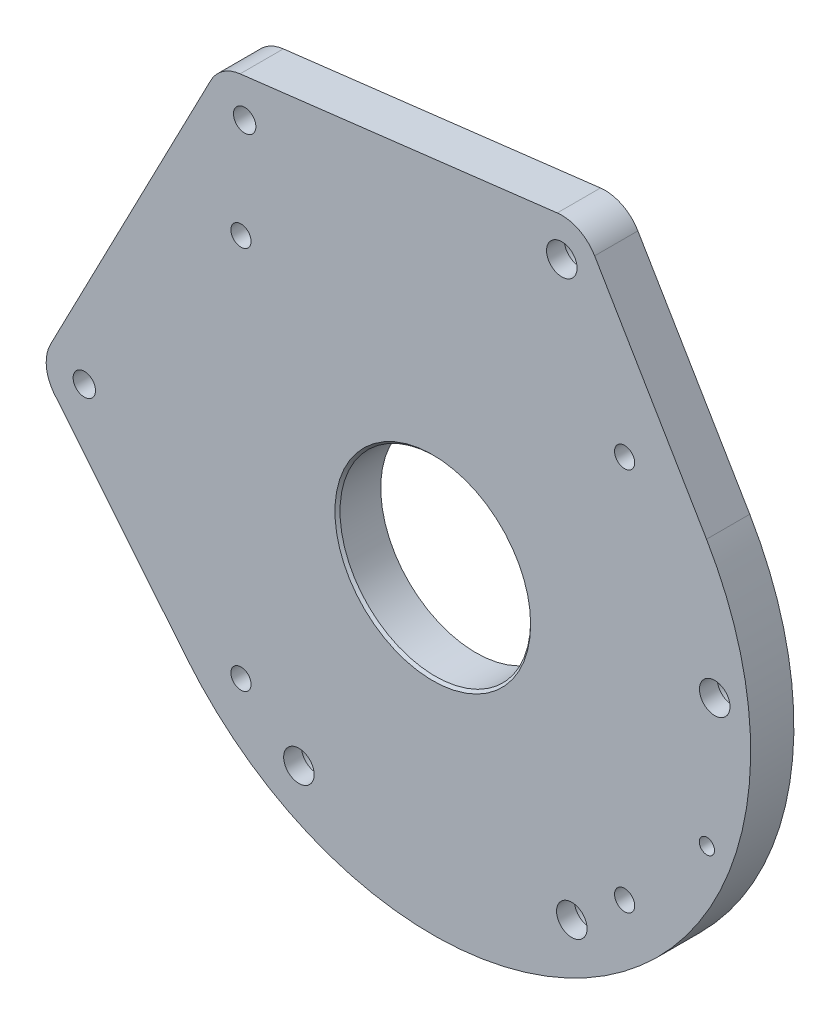
ISO-10303-21;
HEADER;
FILE_DESCRIPTION(('STEP AP214'),'2;1');
FILE_NAME('part.step','',(''),(''),'','','');
FILE_SCHEMA(('AUTOMOTIVE_DESIGN { 1 0 10303 214 1 1 1 1 }'));
ENDSEC;
DATA;
#1=APPLICATION_CONTEXT('core data for automotive mechanical design processes');
#2=APPLICATION_PROTOCOL_DEFINITION('international standard','automotive_design',2000,#1);
#3=PRODUCT_CONTEXT('',#1,'mechanical');
#4=PRODUCT('Part','Part','',(#3));
#5=PRODUCT_RELATED_PRODUCT_CATEGORY('part','',(#4));
#6=PRODUCT_DEFINITION_FORMATION('','',#4);
#7=PRODUCT_DEFINITION_CONTEXT('part definition',#1,'design');
#8=PRODUCT_DEFINITION('design','',#6,#7);
#9=PRODUCT_DEFINITION_SHAPE('','',#8);
#10=(LENGTH_UNIT() NAMED_UNIT(*) SI_UNIT(.MILLI.,.METRE.));
#11=(NAMED_UNIT(*) PLANE_ANGLE_UNIT() SI_UNIT($,.RADIAN.));
#12=(NAMED_UNIT(*) SI_UNIT($,.STERADIAN.) SOLID_ANGLE_UNIT());
#13=UNCERTAINTY_MEASURE_WITH_UNIT(LENGTH_MEASURE(1.E-05),#10,'distance_accuracy_value','');
#14=(GEOMETRIC_REPRESENTATION_CONTEXT(3) GLOBAL_UNCERTAINTY_ASSIGNED_CONTEXT((#13)) GLOBAL_UNIT_ASSIGNED_CONTEXT((#10,
#11,#12)) REPRESENTATION_CONTEXT('',''));
#15=CARTESIAN_POINT('',(0.,0.,0.));
#16=DIRECTION('',(0.,0.,1.));
#17=DIRECTION('',(1.,0.,0.));
#18=AXIS2_PLACEMENT_3D('',#15,#16,#17);
#19=CARTESIAN_POINT('',(0.,0.,0.));
#20=DIRECTION('',(0.,0.,1.));
#21=DIRECTION('',(1.,0.,0.));
#22=AXIS2_PLACEMENT_3D('',#19,#20,#21);
#23=PLANE('',#22);
#24=CARTESIAN_POINT('',(50.73,130.43,0.));
#25=DIRECTION('',(0.,0.,-1.));
#26=DIRECTION('',(-1.,0.,0.));
#27=AXIS2_PLACEMENT_3D('',#24,#25,#26);
#28=CIRCLE('',#27,9.025);
#29=CARTESIAN_POINT('',(41.705,130.43,0.));
#30=VERTEX_POINT('',#29);
#31=EDGE_CURVE('E638',#30,#30,#28,.T.);
#32=ORIENTED_EDGE('',*,*,#31,.F.);
#33=EDGE_LOOP('',(#32));
#34=FACE_BOUND('',#33,.T.);
#35=CARTESIAN_POINT('',(110.87,11.1,0.));
#36=DIRECTION('',(0.,0.,-1.));
#37=DIRECTION('',(-1.,0.,0.));
#38=AXIS2_PLACEMENT_3D('',#35,#36,#37);
#39=CIRCLE('',#38,9.02500000000001);
#40=CARTESIAN_POINT('',(101.845,11.1,0.));
#41=VERTEX_POINT('',#40);
#42=EDGE_CURVE('E172',#41,#41,#39,.T.);
#43=ORIENTED_EDGE('',*,*,#42,.F.);
#44=EDGE_LOOP('',(#43));
#45=FACE_BOUND('',#44,.T.);
#46=CARTESIAN_POINT('',(54.67,-92.57,0.));
#47=DIRECTION('',(0.,0.,-1.));
#48=DIRECTION('',(-1.,0.,0.));
#49=AXIS2_PLACEMENT_3D('',#46,#47,#48);
#50=CIRCLE('',#49,9.025);
#51=CARTESIAN_POINT('',(45.645,-92.57,0.));
#52=VERTEX_POINT('',#51);
#53=EDGE_CURVE('E159',#52,#52,#50,.T.);
#54=ORIENTED_EDGE('',*,*,#53,.F.);
#55=EDGE_LOOP('',(#54));
#56=FACE_BOUND('',#55,.T.);
#57=CARTESIAN_POINT('',(-137.03,-5.98999999999999,0.));
#58=DIRECTION('',(0.,0.,-1.));
#59=DIRECTION('',(-1.,0.,0.));
#60=AXIS2_PLACEMENT_3D('',#57,#58,#59);
#61=CIRCLE('',#60,4.39999999999999);
#62=CARTESIAN_POINT('',(-141.43,-5.98999999999999,0.));
#63=VERTEX_POINT('',#62);
#64=EDGE_CURVE('E222',#63,#63,#61,.T.);
#65=ORIENTED_EDGE('',*,*,#64,.F.);
#66=EDGE_LOOP('',(#65));
#67=FACE_BOUND('',#66,.T.);
#68=CARTESIAN_POINT('',(0.,0.,0.));
#69=DIRECTION('',(0.,0.,1.));
#70=DIRECTION('',(1.,0.,0.));
#71=AXIS2_PLACEMENT_3D('',#68,#69,#70);
#72=CIRCLE('',#71,37.475);
#73=CARTESIAN_POINT('',(37.475,0.,0.));
#74=VERTEX_POINT('',#73);
#75=EDGE_CURVE('E228',#74,#74,#72,.T.);
#76=ORIENTED_EDGE('',*,*,#75,.T.);
#77=EDGE_LOOP('',(#76));
#78=FACE_BOUND('',#77,.T.);
#79=DIRECTION('',(0.508446953838153,-0.86109331383579,0.));
#80=VECTOR('',#79,1.);
#81=CARTESIAN_POINT('',(107.636664229474,63.5558692297692,0.));
#82=LINE('',#81,#80);
#83=CARTESIAN_POINT('',(63.6463997075369,138.056704307572,0.));
#84=VERTEX_POINT('',#83);
#85=CARTESIAN_POINT('',(107.636664229474,63.5558692297692,0.));
#86=VERTEX_POINT('',#85);
#87=EDGE_CURVE('E254',#84,#86,#82,.T.);
#88=ORIENTED_EDGE('',*,*,#87,.T.);
#89=CARTESIAN_POINT('',(0.,0.,0.));
#90=DIRECTION('',(0.,0.,1.));
#91=DIRECTION('',(1.,0.,0.));
#92=AXIS2_PLACEMENT_3D('',#89,#90,#91);
#93=CIRCLE('',#92,125.);
#94=CARTESIAN_POINT('',(-96.9397614082453,-78.9156680141053,0.));
#95=VERTEX_POINT('',#94);
#96=EDGE_CURVE('E84',#95,#86,#93,.T.);
#97=ORIENTED_EDGE('',*,*,#96,.F.);
#98=DIRECTION('',(0.631325344112842,-0.775518091265962,0.));
#99=VECTOR('',#98,1.);
#100=CARTESIAN_POINT('',(-96.9397614082453,-78.9156680141053,0.));
#101=LINE('',#100,#99);
#102=CARTESIAN_POINT('',(-147.843963587509,-16.3851042095525,0.));
#103=VERTEX_POINT('',#102);
#104=EDGE_CURVE('E269',#103,#95,#101,.T.);
#105=ORIENTED_EDGE('',*,*,#104,.F.);
#106=CARTESIAN_POINT('',(-137.03,-5.98999999999999,0.));
#107=DIRECTION('',(0.,0.,1.));
#108=DIRECTION('',(1.,0.,0.));
#109=AXIS2_PLACEMENT_3D('',#106,#107,#108);
#110=CIRCLE('',#109,14.999999999981);
#111=CARTESIAN_POINT('',(-150.342449774275,0.922212453825781,0.));
#112=VERTEX_POINT('',#111);
#113=EDGE_CURVE('E132',#112,#103,#110,.T.);
#114=ORIENTED_EDGE('',*,*,#113,.F.);
#115=DIRECTION('',(0.460814163588969,0.887496651619486,0.));
#116=VECTOR('',#115,1.);
#117=CARTESIAN_POINT('',(-118.794434839627,61.6815376483444,0.));
#118=LINE('',#117,#116);
#119=CARTESIAN_POINT('',(-87.2924497742754,122.352212453826,0.));
#120=VERTEX_POINT('',#119);
#121=EDGE_CURVE('E265',#112,#120,#118,.T.);
#122=ORIENTED_EDGE('',*,*,#121,.T.);
#123=CARTESIAN_POINT('',(-73.98,115.44,0.));
#124=DIRECTION('',(0.,0.,1.));
#125=DIRECTION('',(1.,0.,0.));
#126=AXIS2_PLACEMENT_3D('',#123,#124,#125);
#127=CIRCLE('',#126,14.999999999981);
#128=CARTESIAN_POINT('',(-75.7700978360802,130.332801943781,0.));
#129=VERTEX_POINT('',#128);
#130=EDGE_CURVE('E262',#129,#120,#127,.T.);
#131=ORIENTED_EDGE('',*,*,#130,.F.);
#132=DIRECTION('',(0.992853462919999,0.119339855738833,0.));
#133=VECTOR('',#132,1.);
#134=CARTESIAN_POINT('',(-16.5218590966342,137.454372777759,0.));
#135=LINE('',#134,#133);
#136=CARTESIAN_POINT('',(48.9399021639175,145.3228019438,0.));
#137=VERTEX_POINT('',#136);
#138=EDGE_CURVE('E259',#129,#137,#135,.T.);
#139=ORIENTED_EDGE('',*,*,#138,.T.);
#140=CARTESIAN_POINT('',(50.73,130.43,0.));
#141=DIRECTION('',(0.,0.,1.));
#142=DIRECTION('',(1.,0.,0.));
#143=AXIS2_PLACEMENT_3D('',#140,#141,#142);
#144=CIRCLE('',#143,15.);
#145=EDGE_CURVE('E256',#84,#137,#144,.T.);
#146=ORIENTED_EDGE('',*,*,#145,.F.);
#147=EDGE_LOOP('',(#88,#97,#105,#114,#122,#131,#139,#146));
#148=FACE_BOUND('',#147,.T.);
#149=CARTESIAN_POINT('',(-73.98,115.44,0.));
#150=DIRECTION('',(0.,0.,1.));
#151=DIRECTION('',(1.,0.,0.));
#152=AXIS2_PLACEMENT_3D('',#149,#150,#151);
#153=CIRCLE('',#152,4.4);
#154=CARTESIAN_POINT('',(-69.58,115.44,0.));
#155=VERTEX_POINT('',#154);
#156=EDGE_CURVE('E219',#155,#155,#153,.T.);
#157=ORIENTED_EDGE('',*,*,#156,.T.);
#158=EDGE_LOOP('',(#157));
#159=FACE_BOUND('',#158,.T.);
#160=CARTESIAN_POINT('',(107.78,-40.88,0.));
#161=DIRECTION('',(0.,0.,1.));
#162=DIRECTION('',(1.,0.,0.));
#163=AXIS2_PLACEMENT_3D('',#160,#161,#162);
#164=CIRCLE('',#163,3.);
#165=CARTESIAN_POINT('',(110.78,-40.88,0.));
#166=VERTEX_POINT('',#165);
#167=EDGE_CURVE('E213',#166,#166,#164,.T.);
#168=ORIENTED_EDGE('',*,*,#167,.T.);
#169=EDGE_LOOP('',(#168));
#170=FACE_BOUND('',#169,.T.);
#171=CARTESIAN_POINT('',(75.4341514169814,75.4341514169847,0.));
#172=DIRECTION('',(0.,0.,1.));
#173=DIRECTION('',(1.,0.,0.));
#174=AXIS2_PLACEMENT_3D('',#171,#172,#173);
#175=CIRCLE('',#174,3.96874999999999);
#176=CARTESIAN_POINT('',(79.4029014169814,75.4341514169847,0.));
#177=VERTEX_POINT('',#176);
#178=EDGE_CURVE('E207',#177,#177,#175,.T.);
#179=ORIENTED_EDGE('',*,*,#178,.T.);
#180=EDGE_LOOP('',(#179));
#181=FACE_BOUND('',#180,.T.);
#182=CARTESIAN_POINT('',(75.4341514169848,-75.4341514169771,0.));
#183=DIRECTION('',(0.,0.,1.));
#184=DIRECTION('',(1.,0.,0.));
#185=AXIS2_PLACEMENT_3D('',#182,#183,#184);
#186=CIRCLE('',#185,3.96874999999999);
#187=CARTESIAN_POINT('',(79.4029014169848,-75.4341514169771,0.));
#188=VERTEX_POINT('',#187);
#189=EDGE_CURVE('E201',#188,#188,#186,.T.);
#190=ORIENTED_EDGE('',*,*,#189,.T.);
#191=EDGE_LOOP('',(#190));
#192=FACE_BOUND('',#191,.T.);
#193=CARTESIAN_POINT('',(-75.4341514169771,-75.4341514169806,0.));
#194=DIRECTION('',(0.,0.,1.));
#195=DIRECTION('',(1.,0.,0.));
#196=AXIS2_PLACEMENT_3D('',#193,#194,#195);
#197=CIRCLE('',#196,3.96874999999999);
#198=CARTESIAN_POINT('',(-71.4654014169771,-75.4341514169806,0.));
#199=VERTEX_POINT('',#198);
#200=EDGE_CURVE('E195',#199,#199,#197,.T.);
#201=ORIENTED_EDGE('',*,*,#200,.T.);
#202=EDGE_LOOP('',(#201));
#203=FACE_BOUND('',#202,.T.);
#204=CARTESIAN_POINT('',(-75.4341514169805,75.4341514169813,0.));
#205=DIRECTION('',(0.,0.,1.));
#206=DIRECTION('',(1.,0.,0.));
#207=AXIS2_PLACEMENT_3D('',#204,#205,#206);
#208=CIRCLE('',#207,3.96874999999999);
#209=CARTESIAN_POINT('',(-71.4654014169805,75.4341514169813,0.));
#210=VERTEX_POINT('',#209);
#211=EDGE_CURVE('E189',#210,#210,#208,.T.);
#212=ORIENTED_EDGE('',*,*,#211,.T.);
#213=EDGE_LOOP('',(#212));
#214=FACE_BOUND('',#213,.T.);
#215=CARTESIAN_POINT('',(-52.65,-93.77,0.));
#216=DIRECTION('',(0.,0.,-1.));
#217=DIRECTION('',(-1.,0.,0.));
#218=AXIS2_PLACEMENT_3D('',#215,#216,#217);
#219=CIRCLE('',#218,9.025);
#220=CARTESIAN_POINT('',(-61.675,-93.77,0.));
#221=VERTEX_POINT('',#220);
#222=EDGE_CURVE('E155',#221,#221,#219,.T.);
#223=ORIENTED_EDGE('',*,*,#222,.F.);
#224=EDGE_LOOP('',(#223));
#225=FACE_BOUND('',#224,.T.);
#226=ADVANCED_FACE('F37',(#34,#45,#56,#67,#78,#148,#159,#170,#181,#192,#203,#214,#225),#23,.F.);
#227=CARTESIAN_POINT('',(0.,0.,17.));
#228=DIRECTION('',(0.,0.,1.));
#229=DIRECTION('',(1.,0.,0.));
#230=AXIS2_PLACEMENT_3D('',#227,#228,#229);
#231=PLANE('',#230);
#232=CARTESIAN_POINT('',(0.,0.,17.));
#233=DIRECTION('',(0.,0.,1.));
#234=DIRECTION('',(1.,0.,0.));
#235=AXIS2_PLACEMENT_3D('',#232,#233,#234);
#236=CIRCLE('',#235,38.475);
#237=CARTESIAN_POINT('',(38.475,0.,17.));
#238=VERTEX_POINT('',#237);
#239=EDGE_CURVE('E11',#238,#238,#236,.F.);
#240=ORIENTED_EDGE('',*,*,#239,.T.);
#241=EDGE_LOOP('',(#240));
#242=FACE_BOUND('',#241,.T.);
#243=CARTESIAN_POINT('',(-75.4341514169805,75.4341514169813,17.));
#244=DIRECTION('',(0.,0.,1.));
#245=DIRECTION('',(1.,0.,0.));
#246=AXIS2_PLACEMENT_3D('',#243,#244,#245);
#247=CIRCLE('',#246,3.96874999999999);
#248=CARTESIAN_POINT('',(-71.4654014169805,75.4341514169813,17.));
#249=VERTEX_POINT('',#248);
#250=EDGE_CURVE('E151',#249,#249,#247,.T.);
#251=ORIENTED_EDGE('',*,*,#250,.F.);
#252=EDGE_LOOP('',(#251));
#253=FACE_BOUND('',#252,.T.);
#254=CARTESIAN_POINT('',(-75.4341514169771,-75.4341514169806,17.));
#255=DIRECTION('',(0.,0.,1.));
#256=DIRECTION('',(1.,0.,0.));
#257=AXIS2_PLACEMENT_3D('',#254,#255,#256);
#258=CIRCLE('',#257,3.96874999999999);
#259=CARTESIAN_POINT('',(-71.4654014169771,-75.4341514169806,17.));
#260=VERTEX_POINT('',#259);
#261=EDGE_CURVE('E192',#260,#260,#258,.T.);
#262=ORIENTED_EDGE('',*,*,#261,.F.);
#263=EDGE_LOOP('',(#262));
#264=FACE_BOUND('',#263,.T.);
#265=CARTESIAN_POINT('',(75.4341514169848,-75.4341514169771,17.));
#266=DIRECTION('',(0.,0.,1.));
#267=DIRECTION('',(1.,0.,0.));
#268=AXIS2_PLACEMENT_3D('',#265,#266,#267);
#269=CIRCLE('',#268,3.96874999999999);
#270=CARTESIAN_POINT('',(79.4029014169848,-75.4341514169771,17.));
#271=VERTEX_POINT('',#270);
#272=EDGE_CURVE('E198',#271,#271,#269,.T.);
#273=ORIENTED_EDGE('',*,*,#272,.F.);
#274=EDGE_LOOP('',(#273));
#275=FACE_BOUND('',#274,.T.);
#276=CARTESIAN_POINT('',(75.4341514169814,75.4341514169847,17.));
#277=DIRECTION('',(0.,0.,1.));
#278=DIRECTION('',(1.,0.,0.));
#279=AXIS2_PLACEMENT_3D('',#276,#277,#278);
#280=CIRCLE('',#279,3.96874999999999);
#281=CARTESIAN_POINT('',(79.4029014169814,75.4341514169847,17.));
#282=VERTEX_POINT('',#281);
#283=EDGE_CURVE('E204',#282,#282,#280,.T.);
#284=ORIENTED_EDGE('',*,*,#283,.F.);
#285=EDGE_LOOP('',(#284));
#286=FACE_BOUND('',#285,.T.);
#287=CARTESIAN_POINT('',(107.78,-40.88,17.));
#288=DIRECTION('',(0.,0.,1.));
#289=DIRECTION('',(1.,0.,0.));
#290=AXIS2_PLACEMENT_3D('',#287,#288,#289);
#291=CIRCLE('',#290,3.);
#292=CARTESIAN_POINT('',(110.78,-40.88,17.));
#293=VERTEX_POINT('',#292);
#294=EDGE_CURVE('E210',#293,#293,#291,.T.);
#295=ORIENTED_EDGE('',*,*,#294,.F.);
#296=EDGE_LOOP('',(#295));
#297=FACE_BOUND('',#296,.T.);
#298=CARTESIAN_POINT('',(-73.98,115.44,17.));
#299=DIRECTION('',(0.,0.,1.));
#300=DIRECTION('',(1.,0.,0.));
#301=AXIS2_PLACEMENT_3D('',#298,#299,#300);
#302=CIRCLE('',#301,4.4);
#303=CARTESIAN_POINT('',(-69.58,115.44,17.));
#304=VERTEX_POINT('',#303);
#305=EDGE_CURVE('E216',#304,#304,#302,.T.);
#306=ORIENTED_EDGE('',*,*,#305,.F.);
#307=EDGE_LOOP('',(#306));
#308=FACE_BOUND('',#307,.T.);
#309=DIRECTION('',(0.508446953838153,-0.86109331383579,0.));
#310=VECTOR('',#309,1.);
#311=CARTESIAN_POINT('',(107.636664229474,63.5558692297692,17.));
#312=LINE('',#311,#310);
#313=CARTESIAN_POINT('',(63.6463997075369,138.056704307572,17.));
#314=VERTEX_POINT('',#313);
#315=CARTESIAN_POINT('',(107.636664229474,63.5558692297692,17.));
#316=VERTEX_POINT('',#315);
#317=EDGE_CURVE('E241',#314,#316,#312,.T.);
#318=ORIENTED_EDGE('',*,*,#317,.F.);
#319=CARTESIAN_POINT('',(50.73,130.43,17.));
#320=DIRECTION('',(0.,0.,1.));
#321=DIRECTION('',(1.,0.,0.));
#322=AXIS2_PLACEMENT_3D('',#319,#320,#321);
#323=CIRCLE('',#322,15.);
#324=CARTESIAN_POINT('',(48.9399021639175,145.3228019438,17.));
#325=VERTEX_POINT('',#324);
#326=EDGE_CURVE('E243',#314,#325,#323,.T.);
#327=ORIENTED_EDGE('',*,*,#326,.T.);
#328=DIRECTION('',(0.992853462919999,0.119339855738833,0.));
#329=VECTOR('',#328,1.);
#330=CARTESIAN_POINT('',(-16.5218590966342,137.454372777759,17.));
#331=LINE('',#330,#329);
#332=CARTESIAN_POINT('',(-75.7700978360802,130.332801943781,17.));
#333=VERTEX_POINT('',#332);
#334=EDGE_CURVE('E245',#333,#325,#331,.T.);
#335=ORIENTED_EDGE('',*,*,#334,.F.);
#336=CARTESIAN_POINT('',(-73.98,115.44,17.));
#337=DIRECTION('',(0.,0.,1.));
#338=DIRECTION('',(1.,0.,0.));
#339=AXIS2_PLACEMENT_3D('',#336,#337,#338);
#340=CIRCLE('',#339,14.999999999981);
#341=CARTESIAN_POINT('',(-87.2924497742754,122.352212453826,17.));
#342=VERTEX_POINT('',#341);
#343=EDGE_CURVE('E248',#333,#342,#340,.T.);
#344=ORIENTED_EDGE('',*,*,#343,.T.);
#345=DIRECTION('',(0.460814163588969,0.887496651619486,0.));
#346=VECTOR('',#345,1.);
#347=CARTESIAN_POINT('',(-118.794434839627,61.6815376483444,17.));
#348=LINE('',#347,#346);
#349=CARTESIAN_POINT('',(-150.342449774275,0.922212453825781,17.));
#350=VERTEX_POINT('',#349);
#351=EDGE_CURVE('E127',#350,#342,#348,.T.);
#352=ORIENTED_EDGE('',*,*,#351,.F.);
#353=CARTESIAN_POINT('',(-137.03,-5.98999999999999,17.));
#354=DIRECTION('',(0.,0.,1.));
#355=DIRECTION('',(1.,0.,0.));
#356=AXIS2_PLACEMENT_3D('',#353,#354,#355);
#357=CIRCLE('',#356,14.999999999981);
#358=CARTESIAN_POINT('',(-147.843963587509,-16.3851042095525,17.));
#359=VERTEX_POINT('',#358);
#360=EDGE_CURVE('E120',#350,#359,#357,.T.);
#361=ORIENTED_EDGE('',*,*,#360,.T.);
#362=DIRECTION('',(0.631325344112842,-0.775518091265962,0.));
#363=VECTOR('',#362,1.);
#364=CARTESIAN_POINT('',(-96.9397614082453,-78.9156680141053,17.));
#365=LINE('',#364,#363);
#366=CARTESIAN_POINT('',(-96.9397614082453,-78.9156680141053,17.));
#367=VERTEX_POINT('',#366);
#368=EDGE_CURVE('E112',#359,#367,#365,.T.);
#369=ORIENTED_EDGE('',*,*,#368,.T.);
#370=CARTESIAN_POINT('',(0.,0.,17.));
#371=DIRECTION('',(0.,0.,1.));
#372=DIRECTION('',(1.,0.,0.));
#373=AXIS2_PLACEMENT_3D('',#370,#371,#372);
#374=CIRCLE('',#373,125.);
#375=EDGE_CURVE('E56',#367,#316,#374,.T.);
#376=ORIENTED_EDGE('',*,*,#375,.T.);
#377=EDGE_LOOP('',(#318,#327,#335,#344,#352,#361,#369,#376));
#378=FACE_BOUND('',#377,.T.);
#379=CARTESIAN_POINT('',(-52.65,-93.77,17.));
#380=DIRECTION('',(0.,0.,1.));
#381=DIRECTION('',(1.,0.,0.));
#382=AXIS2_PLACEMENT_3D('',#379,#380,#381);
#383=CIRCLE('',#382,6.);
#384=CARTESIAN_POINT('',(-46.65,-93.77,17.));
#385=VERTEX_POINT('',#384);
#386=EDGE_CURVE('E238',#385,#385,#383,.T.);
#387=ORIENTED_EDGE('',*,*,#386,.F.);
#388=EDGE_LOOP('',(#387));
#389=FACE_BOUND('',#388,.T.);
#390=CARTESIAN_POINT('',(54.67,-92.57,17.));
#391=DIRECTION('',(0.,0.,1.));
#392=DIRECTION('',(1.,0.,0.));
#393=AXIS2_PLACEMENT_3D('',#390,#391,#392);
#394=CIRCLE('',#393,6.);
#395=CARTESIAN_POINT('',(60.67,-92.57,17.));
#396=VERTEX_POINT('',#395);
#397=EDGE_CURVE('E235',#396,#396,#394,.T.);
#398=ORIENTED_EDGE('',*,*,#397,.F.);
#399=EDGE_LOOP('',(#398));
#400=FACE_BOUND('',#399,.T.);
#401=CARTESIAN_POINT('',(110.87,11.1,17.));
#402=DIRECTION('',(0.,0.,1.));
#403=DIRECTION('',(1.,0.,0.));
#404=AXIS2_PLACEMENT_3D('',#401,#402,#403);
#405=CIRCLE('',#404,6.);
#406=CARTESIAN_POINT('',(116.87,11.1,17.));
#407=VERTEX_POINT('',#406);
#408=EDGE_CURVE('E232',#407,#407,#405,.T.);
#409=ORIENTED_EDGE('',*,*,#408,.F.);
#410=EDGE_LOOP('',(#409));
#411=FACE_BOUND('',#410,.T.);
#412=CARTESIAN_POINT('',(50.73,130.43,17.));
#413=DIRECTION('',(0.,0.,1.));
#414=DIRECTION('',(1.,0.,0.));
#415=AXIS2_PLACEMENT_3D('',#412,#413,#414);
#416=CIRCLE('',#415,6.);
#417=CARTESIAN_POINT('',(56.73,130.43,17.));
#418=VERTEX_POINT('',#417);
#419=EDGE_CURVE('E229',#418,#418,#416,.T.);
#420=ORIENTED_EDGE('',*,*,#419,.F.);
#421=EDGE_LOOP('',(#420));
#422=FACE_BOUND('',#421,.T.);
#423=CARTESIAN_POINT('',(-137.03,-5.98999999999999,17.));
#424=DIRECTION('',(0.,0.,-1.));
#425=DIRECTION('',(-1.,0.,0.));
#426=AXIS2_PLACEMENT_3D('',#423,#424,#425);
#427=CIRCLE('',#426,4.39999999999999);
#428=CARTESIAN_POINT('',(-141.43,-5.98999999999999,17.));
#429=VERTEX_POINT('',#428);
#430=EDGE_CURVE('E225',#429,#429,#427,.T.);
#431=ORIENTED_EDGE('',*,*,#430,.T.);
#432=EDGE_LOOP('',(#431));
#433=FACE_BOUND('',#432,.T.);
#434=ADVANCED_FACE('F124',(#242,#253,#264,#275,#286,#297,#308,#378,#389,#400,#411,#422,#433),
#231,.T.);
#435=CARTESIAN_POINT('',(107.636664229474,63.5558692297692,17.));
#436=DIRECTION('',(0.86109331383579,0.508446953838153,0.));
#437=DIRECTION('',(-0.508446953838153,0.86109331383579,0.));
#438=AXIS2_PLACEMENT_3D('',#435,#436,#437);
#439=PLANE('',#438);
#440=ORIENTED_EDGE('',*,*,#87,.F.);
#441=DIRECTION('',(0.,0.,-1.));
#442=VECTOR('',#441,1.);
#443=CARTESIAN_POINT('',(63.6463997075369,138.056704307572,17.));
#444=LINE('',#443,#442);
#445=EDGE_CURVE('E95',#314,#84,#444,.T.);
#446=ORIENTED_EDGE('',*,*,#445,.F.);
#447=ORIENTED_EDGE('',*,*,#317,.T.);
#448=DIRECTION('',(0.,0.,-1.));
#449=VECTOR('',#448,1.);
#450=CARTESIAN_POINT('',(107.636664229474,63.5558692297692,17.));
#451=LINE('',#450,#449);
#452=EDGE_CURVE('E91',#316,#86,#451,.T.);
#453=ORIENTED_EDGE('',*,*,#452,.T.);
#454=EDGE_LOOP('',(#440,#446,#447,#453));
#455=FACE_BOUND('',#454,.T.);
#456=ADVANCED_FACE('F275',(#455),#439,.T.);
#457=CARTESIAN_POINT('',(50.73,130.43,17.));
#458=DIRECTION('',(0.,0.,-1.));
#459=DIRECTION('',(-1.,0.,0.));
#460=AXIS2_PLACEMENT_3D('',#457,#458,#459);
#461=CYLINDRICAL_SURFACE('',#460,15.);
#462=ORIENTED_EDGE('',*,*,#145,.T.);
#463=DIRECTION('',(0.,0.,-1.));
#464=VECTOR('',#463,1.);
#465=CARTESIAN_POINT('',(48.9399021639175,145.3228019438,17.));
#466=LINE('',#465,#464);
#467=EDGE_CURVE('E143',#325,#137,#466,.T.);
#468=ORIENTED_EDGE('',*,*,#467,.F.);
#469=ORIENTED_EDGE('',*,*,#326,.F.);
#470=ORIENTED_EDGE('',*,*,#445,.T.);
#471=EDGE_LOOP('',(#462,#468,#469,#470));
#472=FACE_BOUND('',#471,.T.);
#473=ADVANCED_FACE('F277',(#472),#461,.T.);
#474=CARTESIAN_POINT('',(-16.5218590966342,137.454372777759,17.));
#475=DIRECTION('',(-0.119339855738833,0.992853462919999,0.));
#476=DIRECTION('',(-0.992853462919999,-0.119339855738833,0.));
#477=AXIS2_PLACEMENT_3D('',#474,#475,#476);
#478=PLANE('',#477);
#479=ORIENTED_EDGE('',*,*,#138,.F.);
#480=DIRECTION('',(0.,0.,-1.));
#481=VECTOR('',#480,1.);
#482=CARTESIAN_POINT('',(-75.7700978360802,130.332801943781,17.));
#483=LINE('',#482,#481);
#484=EDGE_CURVE('E141',#333,#129,#483,.T.);
#485=ORIENTED_EDGE('',*,*,#484,.F.);
#486=ORIENTED_EDGE('',*,*,#334,.T.);
#487=ORIENTED_EDGE('',*,*,#467,.T.);
#488=EDGE_LOOP('',(#479,#485,#486,#487));
#489=FACE_BOUND('',#488,.T.);
#490=ADVANCED_FACE('F283',(#489),#478,.T.);
#491=CARTESIAN_POINT('',(-73.98,115.44,17.));
#492=DIRECTION('',(0.,0.,-1.));
#493=DIRECTION('',(-1.,0.,0.));
#494=AXIS2_PLACEMENT_3D('',#491,#492,#493);
#495=CYLINDRICAL_SURFACE('',#494,14.999999999981);
#496=ORIENTED_EDGE('',*,*,#130,.T.);
#497=DIRECTION('',(0.,0.,-1.));
#498=VECTOR('',#497,1.);
#499=CARTESIAN_POINT('',(-87.2924497742754,122.352212453826,17.));
#500=LINE('',#499,#498);
#501=EDGE_CURVE('E135',#342,#120,#500,.T.);
#502=ORIENTED_EDGE('',*,*,#501,.F.);
#503=ORIENTED_EDGE('',*,*,#343,.F.);
#504=ORIENTED_EDGE('',*,*,#484,.T.);
#505=EDGE_LOOP('',(#496,#502,#503,#504));
#506=FACE_BOUND('',#505,.T.);
#507=ADVANCED_FACE('F310',(#506),#495,.T.);
#508=CARTESIAN_POINT('',(-118.794434839627,61.6815376483444,17.));
#509=DIRECTION('',(-0.887496651619486,0.46081416358897,0.));
#510=DIRECTION('',(-0.460814163588969,-0.887496651619486,0.));
#511=AXIS2_PLACEMENT_3D('',#508,#509,#510);
#512=PLANE('',#511);
#513=ORIENTED_EDGE('',*,*,#121,.F.);
#514=DIRECTION('',(0.,0.,-1.));
#515=VECTOR('',#514,1.);
#516=CARTESIAN_POINT('',(-150.342449774275,0.922212453825781,17.));
#517=LINE('',#516,#515);
#518=EDGE_CURVE('E133',#350,#112,#517,.T.);
#519=ORIENTED_EDGE('',*,*,#518,.F.);
#520=ORIENTED_EDGE('',*,*,#351,.T.);
#521=ORIENTED_EDGE('',*,*,#501,.T.);
#522=EDGE_LOOP('',(#513,#519,#520,#521));
#523=FACE_BOUND('',#522,.T.);
#524=ADVANCED_FACE('F307',(#523),#512,.T.);
#525=CARTESIAN_POINT('',(-137.03,-5.98999999999999,17.));
#526=DIRECTION('',(0.,0.,-1.));
#527=DIRECTION('',(-1.,0.,0.));
#528=AXIS2_PLACEMENT_3D('',#525,#526,#527);
#529=CYLINDRICAL_SURFACE('',#528,14.999999999981);
#530=ORIENTED_EDGE('',*,*,#113,.T.);
#531=DIRECTION('',(0.,0.,-1.));
#532=VECTOR('',#531,1.);
#533=CARTESIAN_POINT('',(-147.843963587509,-16.3851042095525,17.));
#534=LINE('',#533,#532);
#535=EDGE_CURVE('E117',#359,#103,#534,.T.);
#536=ORIENTED_EDGE('',*,*,#535,.F.);
#537=ORIENTED_EDGE('',*,*,#360,.F.);
#538=ORIENTED_EDGE('',*,*,#518,.T.);
#539=EDGE_LOOP('',(#530,#536,#537,#538));
#540=FACE_BOUND('',#539,.T.);
#541=ADVANCED_FACE('F130',(#540),#529,.T.);
#542=CARTESIAN_POINT('',(-96.9397614082453,-78.9156680141053,17.));
#543=DIRECTION('',(0.775518091265962,0.631325344112842,0.));
#544=DIRECTION('',(-0.631325344112842,0.775518091265962,0.));
#545=AXIS2_PLACEMENT_3D('',#542,#543,#544);
#546=PLANE('',#545);
#547=ORIENTED_EDGE('',*,*,#104,.T.);
#548=DIRECTION('',(0.,0.,-1.));
#549=VECTOR('',#548,1.);
#550=CARTESIAN_POINT('',(-96.9397614082453,-78.9156680141053,17.));
#551=LINE('',#550,#549);
#552=EDGE_CURVE('E119',#367,#95,#551,.T.);
#553=ORIENTED_EDGE('',*,*,#552,.F.);
#554=ORIENTED_EDGE('',*,*,#368,.F.);
#555=ORIENTED_EDGE('',*,*,#535,.T.);
#556=EDGE_LOOP('',(#547,#553,#554,#555));
#557=FACE_BOUND('',#556,.T.);
#558=ADVANCED_FACE('F115',(#557),#546,.F.);
#559=CARTESIAN_POINT('',(-52.65,-93.77,17.));
#560=DIRECTION('',(0.,0.,-1.));
#561=DIRECTION('',(-1.,0.,0.));
#562=AXIS2_PLACEMENT_3D('',#559,#560,#561);
#563=CYLINDRICAL_SURFACE('',#562,6.);
#564=CARTESIAN_POINT('',(-52.65,-93.77,10.));
#565=DIRECTION('',(0.,0.,1.));
#566=DIRECTION('',(1.,0.,0.));
#567=AXIS2_PLACEMENT_3D('',#564,#565,#566);
#568=CIRCLE('',#567,6.);
#569=CARTESIAN_POINT('',(-46.65,-93.77,10.));
#570=VERTEX_POINT('',#569);
#571=EDGE_CURVE('E148',#570,#570,#568,.T.);
#572=ORIENTED_EDGE('',*,*,#571,.F.);
#573=EDGE_LOOP('',(#572));
#574=FACE_BOUND('',#573,.T.);
#575=ORIENTED_EDGE('',*,*,#386,.T.);
#576=EDGE_LOOP('',(#575));
#577=FACE_BOUND('',#576,.T.);
#578=ADVANCED_FACE('F304',(#574,#577),#563,.F.);
#579=CARTESIAN_POINT('',(54.67,-92.57,17.));
#580=DIRECTION('',(0.,0.,-1.));
#581=DIRECTION('',(-1.,0.,0.));
#582=AXIS2_PLACEMENT_3D('',#579,#580,#581);
#583=CYLINDRICAL_SURFACE('',#582,6.);
#584=CARTESIAN_POINT('',(54.67,-92.57,10.));
#585=DIRECTION('',(0.,0.,1.));
#586=DIRECTION('',(1.,0.,0.));
#587=AXIS2_PLACEMENT_3D('',#584,#585,#586);
#588=CIRCLE('',#587,6.);
#589=CARTESIAN_POINT('',(60.67,-92.57,10.));
#590=VERTEX_POINT('',#589);
#591=EDGE_CURVE('E153',#590,#590,#588,.T.);
#592=ORIENTED_EDGE('',*,*,#591,.F.);
#593=EDGE_LOOP('',(#592));
#594=FACE_BOUND('',#593,.T.);
#595=ORIENTED_EDGE('',*,*,#397,.T.);
#596=EDGE_LOOP('',(#595));
#597=FACE_BOUND('',#596,.T.);
#598=ADVANCED_FACE('F351',(#594,#597),#583,.F.);
#599=CARTESIAN_POINT('',(110.87,11.1,17.));
#600=DIRECTION('',(0.,0.,-1.));
#601=DIRECTION('',(-1.,0.,0.));
#602=AXIS2_PLACEMENT_3D('',#599,#600,#601);
#603=CYLINDRICAL_SURFACE('',#602,6.);
#604=CARTESIAN_POINT('',(110.87,11.1,10.));
#605=DIRECTION('',(0.,0.,1.));
#606=DIRECTION('',(1.,0.,0.));
#607=AXIS2_PLACEMENT_3D('',#604,#605,#606);
#608=CIRCLE('',#607,6.);
#609=CARTESIAN_POINT('',(116.87,11.1,10.));
#610=VERTEX_POINT('',#609);
#611=EDGE_CURVE('E157',#610,#610,#608,.T.);
#612=ORIENTED_EDGE('',*,*,#611,.F.);
#613=EDGE_LOOP('',(#612));
#614=FACE_BOUND('',#613,.T.);
#615=ORIENTED_EDGE('',*,*,#408,.T.);
#616=EDGE_LOOP('',(#615));
#617=FACE_BOUND('',#616,.T.);
#618=ADVANCED_FACE('F358',(#614,#617),#603,.F.);
#619=CARTESIAN_POINT('',(50.73,130.43,17.));
#620=DIRECTION('',(0.,0.,-1.));
#621=DIRECTION('',(-1.,0.,0.));
#622=AXIS2_PLACEMENT_3D('',#619,#620,#621);
#623=CYLINDRICAL_SURFACE('',#622,6.);
#624=CARTESIAN_POINT('',(50.73,130.43,10.));
#625=DIRECTION('',(0.,0.,1.));
#626=DIRECTION('',(1.,0.,0.));
#627=AXIS2_PLACEMENT_3D('',#624,#625,#626);
#628=CIRCLE('',#627,6.);
#629=CARTESIAN_POINT('',(56.73,130.43,10.));
#630=VERTEX_POINT('',#629);
#631=EDGE_CURVE('E41',#630,#630,#628,.T.);
#632=ORIENTED_EDGE('',*,*,#631,.F.);
#633=EDGE_LOOP('',(#632));
#634=FACE_BOUND('',#633,.T.);
#635=ORIENTED_EDGE('',*,*,#419,.T.);
#636=EDGE_LOOP('',(#635));
#637=FACE_BOUND('',#636,.T.);
#638=ADVANCED_FACE('F366',(#634,#637),#623,.F.);
#639=CARTESIAN_POINT('',(0.,0.,17.));
#640=DIRECTION('',(0.,0.,-1.));
#641=DIRECTION('',(-1.,0.,0.));
#642=AXIS2_PLACEMENT_3D('',#639,#640,#641);
#643=CYLINDRICAL_SURFACE('',#642,37.475);
#644=CARTESIAN_POINT('',(0.,0.,16.));
#645=DIRECTION('',(0.,0.,1.));
#646=DIRECTION('',(1.,0.,0.));
#647=AXIS2_PLACEMENT_3D('',#644,#645,#646);
#648=CIRCLE('',#647,37.475);
#649=CARTESIAN_POINT('',(37.475,0.,16.));
#650=VERTEX_POINT('',#649);
#651=EDGE_CURVE('E47',#650,#650,#648,.T.);
#652=ORIENTED_EDGE('',*,*,#651,.T.);
#653=EDGE_LOOP('',(#652));
#654=FACE_BOUND('',#653,.T.);
#655=ORIENTED_EDGE('',*,*,#75,.F.);
#656=EDGE_LOOP('',(#655));
#657=FACE_BOUND('',#656,.T.);
#658=ADVANCED_FACE('F301',(#654,#657),#643,.F.);
#659=CARTESIAN_POINT('',(0.,0.,17.));
#660=DIRECTION('',(0.,0.,-1.));
#661=DIRECTION('',(-1.,0.,0.));
#662=AXIS2_PLACEMENT_3D('',#659,#660,#661);
#663=CYLINDRICAL_SURFACE('',#662,125.);
#664=ORIENTED_EDGE('',*,*,#96,.T.);
#665=ORIENTED_EDGE('',*,*,#452,.F.);
#666=ORIENTED_EDGE('',*,*,#375,.F.);
#667=ORIENTED_EDGE('',*,*,#552,.T.);
#668=EDGE_LOOP('',(#664,#665,#666,#667));
#669=FACE_BOUND('',#668,.T.);
#670=ADVANCED_FACE('F272',(#669),#663,.T.);
#671=CARTESIAN_POINT('',(-137.03,-5.98999999999999,0.));
#672=DIRECTION('',(0.,0.,-1.));
#673=DIRECTION('',(-1.,0.,0.));
#674=AXIS2_PLACEMENT_3D('',#671,#672,#673);
#675=CYLINDRICAL_SURFACE('',#674,4.39999999999999);
#676=ORIENTED_EDGE('',*,*,#430,.F.);
#677=EDGE_LOOP('',(#676));
#678=FACE_BOUND('',#677,.T.);
#679=ORIENTED_EDGE('',*,*,#64,.T.);
#680=EDGE_LOOP('',(#679));
#681=FACE_BOUND('',#680,.T.);
#682=ADVANCED_FACE('F300',(#678,#681),#675,.F.);
#683=CARTESIAN_POINT('',(-73.98,115.44,17.));
#684=DIRECTION('',(0.,0.,1.));
#685=DIRECTION('',(1.,0.,0.));
#686=AXIS2_PLACEMENT_3D('',#683,#684,#685);
#687=CYLINDRICAL_SURFACE('',#686,4.4);
#688=ORIENTED_EDGE('',*,*,#156,.F.);
#689=EDGE_LOOP('',(#688));
#690=FACE_BOUND('',#689,.T.);
#691=ORIENTED_EDGE('',*,*,#305,.T.);
#692=EDGE_LOOP('',(#691));
#693=FACE_BOUND('',#692,.T.);
#694=ADVANCED_FACE('F394',(#690,#693),#687,.F.);
#695=CARTESIAN_POINT('',(107.78,-40.88,17.));
#696=DIRECTION('',(0.,0.,1.));
#697=DIRECTION('',(1.,0.,0.));
#698=AXIS2_PLACEMENT_3D('',#695,#696,#697);
#699=CYLINDRICAL_SURFACE('',#698,3.);
#700=ORIENTED_EDGE('',*,*,#167,.F.);
#701=EDGE_LOOP('',(#700));
#702=FACE_BOUND('',#701,.T.);
#703=ORIENTED_EDGE('',*,*,#294,.T.);
#704=EDGE_LOOP('',(#703));
#705=FACE_BOUND('',#704,.T.);
#706=ADVANCED_FACE('F401',(#702,#705),#699,.F.);
#707=CARTESIAN_POINT('',(75.4341514169814,75.4341514169847,17.));
#708=DIRECTION('',(0.,0.,1.));
#709=DIRECTION('',(1.,0.,0.));
#710=AXIS2_PLACEMENT_3D('',#707,#708,#709);
#711=CYLINDRICAL_SURFACE('',#710,3.96874999999999);
#712=ORIENTED_EDGE('',*,*,#178,.F.);
#713=EDGE_LOOP('',(#712));
#714=FACE_BOUND('',#713,.T.);
#715=ORIENTED_EDGE('',*,*,#283,.T.);
#716=EDGE_LOOP('',(#715));
#717=FACE_BOUND('',#716,.T.);
#718=ADVANCED_FACE('F409',(#714,#717),#711,.F.);
#719=CARTESIAN_POINT('',(75.4341514169848,-75.4341514169771,17.));
#720=DIRECTION('',(0.,0.,1.));
#721=DIRECTION('',(1.,0.,0.));
#722=AXIS2_PLACEMENT_3D('',#719,#720,#721);
#723=CYLINDRICAL_SURFACE('',#722,3.96874999999999);
#724=ORIENTED_EDGE('',*,*,#189,.F.);
#725=EDGE_LOOP('',(#724));
#726=FACE_BOUND('',#725,.T.);
#727=ORIENTED_EDGE('',*,*,#272,.T.);
#728=EDGE_LOOP('',(#727));
#729=FACE_BOUND('',#728,.T.);
#730=ADVANCED_FACE('F418',(#726,#729),#723,.F.);
#731=CARTESIAN_POINT('',(-75.4341514169771,-75.4341514169806,17.));
#732=DIRECTION('',(0.,0.,1.));
#733=DIRECTION('',(1.,0.,0.));
#734=AXIS2_PLACEMENT_3D('',#731,#732,#733);
#735=CYLINDRICAL_SURFACE('',#734,3.96874999999999);
#736=ORIENTED_EDGE('',*,*,#200,.F.);
#737=EDGE_LOOP('',(#736));
#738=FACE_BOUND('',#737,.T.);
#739=ORIENTED_EDGE('',*,*,#261,.T.);
#740=EDGE_LOOP('',(#739));
#741=FACE_BOUND('',#740,.T.);
#742=ADVANCED_FACE('F425',(#738,#741),#735,.F.);
#743=CARTESIAN_POINT('',(-75.4341514169805,75.4341514169813,17.));
#744=DIRECTION('',(0.,0.,1.));
#745=DIRECTION('',(1.,0.,0.));
#746=AXIS2_PLACEMENT_3D('',#743,#744,#745);
#747=CYLINDRICAL_SURFACE('',#746,3.96874999999999);
#748=ORIENTED_EDGE('',*,*,#211,.F.);
#749=EDGE_LOOP('',(#748));
#750=FACE_BOUND('',#749,.T.);
#751=ORIENTED_EDGE('',*,*,#250,.T.);
#752=EDGE_LOOP('',(#751));
#753=FACE_BOUND('',#752,.T.);
#754=ADVANCED_FACE('F433',(#750,#753),#747,.F.);
#755=CARTESIAN_POINT('',(0.,0.,16.));
#756=DIRECTION('',(0.,0.,1.));
#757=DIRECTION('',(1.,0.,0.));
#758=AXIS2_PLACEMENT_3D('',#755,#756,#757);
#759=CONICAL_SURFACE('',#758,37.475,0.785398163397438);
#760=ORIENTED_EDGE('',*,*,#239,.F.);
#761=EDGE_LOOP('',(#760));
#762=FACE_BOUND('',#761,.T.);
#763=ORIENTED_EDGE('',*,*,#651,.F.);
#764=EDGE_LOOP('',(#763));
#765=FACE_BOUND('',#764,.T.);
#766=ADVANCED_FACE('F39',(#762,#765),#759,.F.);
#767=CARTESIAN_POINT('',(-43.65,-93.77,10.));
#768=DIRECTION('',(0.,0.,1.));
#769=DIRECTION('',(1.,0.,0.));
#770=AXIS2_PLACEMENT_3D('',#767,#768,#769);
#771=PLANE('',#770);
#772=ORIENTED_EDGE('',*,*,#571,.T.);
#773=EDGE_LOOP('',(#772));
#774=FACE_BOUND('',#773,.T.);
#775=CARTESIAN_POINT('',(-52.65,-93.77,10.));
#776=DIRECTION('',(0.,0.,-1.));
#777=DIRECTION('',(-1.,0.,0.));
#778=AXIS2_PLACEMENT_3D('',#775,#776,#777);
#779=CIRCLE('',#778,8.99999999999999);
#780=CARTESIAN_POINT('',(-61.65,-93.77,10.));
#781=VERTEX_POINT('',#780);
#782=EDGE_CURVE('E152',#781,#781,#779,.T.);
#783=ORIENTED_EDGE('',*,*,#782,.T.);
#784=EDGE_LOOP('',(#783));
#785=FACE_BOUND('',#784,.T.);
#786=ADVANCED_FACE('F446',(#774,#785),#771,.F.);
#787=CARTESIAN_POINT('',(-52.65,-93.77,0.));
#788=DIRECTION('',(0.,0.,-1.));
#789=DIRECTION('',(-1.,0.,0.));
#790=AXIS2_PLACEMENT_3D('',#787,#788,#789);
#791=CYLINDRICAL_SURFACE('',#790,8.99999999999999);
#792=ORIENTED_EDGE('',*,*,#782,.F.);
#793=EDGE_LOOP('',(#792));
#794=FACE_BOUND('',#793,.T.);
#795=CARTESIAN_POINT('',(-52.65,-93.77,0.0250000000000017));
#796=DIRECTION('',(0.,0.,-1.));
#797=DIRECTION('',(-1.,0.,0.));
#798=AXIS2_PLACEMENT_3D('',#795,#796,#797);
#799=CIRCLE('',#798,8.99999999999999);
#800=CARTESIAN_POINT('',(-61.65,-93.77,0.0250000000000017));
#801=VERTEX_POINT('',#800);
#802=EDGE_CURVE('E182',#801,#801,#799,.T.);
#803=ORIENTED_EDGE('',*,*,#802,.T.);
#804=EDGE_LOOP('',(#803));
#805=FACE_BOUND('',#804,.T.);
#806=ADVANCED_FACE('F452',(#794,#805),#791,.F.);
#807=CARTESIAN_POINT('',(-52.65,-93.77,0.));
#808=DIRECTION('',(0.,0.,-1.));
#809=DIRECTION('',(-1.,0.,0.));
#810=AXIS2_PLACEMENT_3D('',#807,#808,#809);
#811=CONICAL_SURFACE('',#810,9.025,0.785398163397499);
#812=ORIENTED_EDGE('',*,*,#802,.F.);
#813=EDGE_LOOP('',(#812));
#814=FACE_BOUND('',#813,.T.);
#815=ORIENTED_EDGE('',*,*,#222,.T.);
#816=EDGE_LOOP('',(#815));
#817=FACE_BOUND('',#816,.T.);
#818=ADVANCED_FACE('F460',(#814,#817),#811,.F.);
#819=CARTESIAN_POINT('',(63.67,-92.57,10.));
#820=DIRECTION('',(0.,0.,1.));
#821=DIRECTION('',(1.,0.,0.));
#822=AXIS2_PLACEMENT_3D('',#819,#820,#821);
#823=PLANE('',#822);
#824=ORIENTED_EDGE('',*,*,#591,.T.);
#825=EDGE_LOOP('',(#824));
#826=FACE_BOUND('',#825,.T.);
#827=CARTESIAN_POINT('',(54.67,-92.57,10.));
#828=DIRECTION('',(0.,0.,-1.));
#829=DIRECTION('',(-1.,0.,0.));
#830=AXIS2_PLACEMENT_3D('',#827,#828,#829);
#831=CIRCLE('',#830,9.);
#832=CARTESIAN_POINT('',(45.67,-92.57,10.));
#833=VERTEX_POINT('',#832);
#834=EDGE_CURVE('E156',#833,#833,#831,.T.);
#835=ORIENTED_EDGE('',*,*,#834,.T.);
#836=EDGE_LOOP('',(#835));
#837=FACE_BOUND('',#836,.T.);
#838=ADVANCED_FACE('F468',(#826,#837),#823,.F.);
#839=CARTESIAN_POINT('',(54.67,-92.57,0.));
#840=DIRECTION('',(0.,0.,-1.));
#841=DIRECTION('',(-1.,0.,0.));
#842=AXIS2_PLACEMENT_3D('',#839,#840,#841);
#843=CYLINDRICAL_SURFACE('',#842,9.);
#844=ORIENTED_EDGE('',*,*,#834,.F.);
#845=EDGE_LOOP('',(#844));
#846=FACE_BOUND('',#845,.T.);
#847=CARTESIAN_POINT('',(54.67,-92.57,0.0250000000000017));
#848=DIRECTION('',(0.,0.,-1.));
#849=DIRECTION('',(-1.,0.,0.));
#850=AXIS2_PLACEMENT_3D('',#847,#848,#849);
#851=CIRCLE('',#850,9.);
#852=CARTESIAN_POINT('',(45.67,-92.57,0.0250000000000017));
#853=VERTEX_POINT('',#852);
#854=EDGE_CURVE('E164',#853,#853,#851,.T.);
#855=ORIENTED_EDGE('',*,*,#854,.T.);
#856=EDGE_LOOP('',(#855));
#857=FACE_BOUND('',#856,.T.);
#858=ADVANCED_FACE('F476',(#846,#857),#843,.F.);
#859=CARTESIAN_POINT('',(54.67,-92.57,0.));
#860=DIRECTION('',(0.,0.,-1.));
#861=DIRECTION('',(-1.,0.,0.));
#862=AXIS2_PLACEMENT_3D('',#859,#860,#861);
#863=CONICAL_SURFACE('',#862,9.025,0.78539816339736);
#864=ORIENTED_EDGE('',*,*,#854,.F.);
#865=EDGE_LOOP('',(#864));
#866=FACE_BOUND('',#865,.T.);
#867=ORIENTED_EDGE('',*,*,#53,.T.);
#868=EDGE_LOOP('',(#867));
#869=FACE_BOUND('',#868,.T.);
#870=ADVANCED_FACE('F484',(#866,#869),#863,.F.);
#871=CARTESIAN_POINT('',(119.87,11.1,10.));
#872=DIRECTION('',(0.,0.,1.));
#873=DIRECTION('',(1.,0.,0.));
#874=AXIS2_PLACEMENT_3D('',#871,#872,#873);
#875=PLANE('',#874);
#876=ORIENTED_EDGE('',*,*,#611,.T.);
#877=EDGE_LOOP('',(#876));
#878=FACE_BOUND('',#877,.T.);
#879=CARTESIAN_POINT('',(110.87,11.1,10.));
#880=DIRECTION('',(0.,0.,-1.));
#881=DIRECTION('',(-1.,0.,0.));
#882=AXIS2_PLACEMENT_3D('',#879,#880,#881);
#883=CIRCLE('',#882,8.99999999999999);
#884=CARTESIAN_POINT('',(101.87,11.1,10.));
#885=VERTEX_POINT('',#884);
#886=EDGE_CURVE('E160',#885,#885,#883,.T.);
#887=ORIENTED_EDGE('',*,*,#886,.T.);
#888=EDGE_LOOP('',(#887));
#889=FACE_BOUND('',#888,.T.);
#890=ADVANCED_FACE('F492',(#878,#889),#875,.F.);
#891=CARTESIAN_POINT('',(110.87,11.1,0.));
#892=DIRECTION('',(0.,0.,-1.));
#893=DIRECTION('',(-1.,0.,0.));
#894=AXIS2_PLACEMENT_3D('',#891,#892,#893);
#895=CYLINDRICAL_SURFACE('',#894,8.99999999999999);
#896=ORIENTED_EDGE('',*,*,#886,.F.);
#897=EDGE_LOOP('',(#896));
#898=FACE_BOUND('',#897,.T.);
#899=CARTESIAN_POINT('',(110.87,11.1,0.0250000000000017));
#900=DIRECTION('',(0.,0.,-1.));
#901=DIRECTION('',(-1.,0.,0.));
#902=AXIS2_PLACEMENT_3D('',#899,#900,#901);
#903=CIRCLE('',#902,8.99999999999999);
#904=CARTESIAN_POINT('',(101.87,11.1,0.0250000000000017));
#905=VERTEX_POINT('',#904);
#906=EDGE_CURVE('E167',#905,#905,#903,.T.);
#907=ORIENTED_EDGE('',*,*,#906,.T.);
#908=EDGE_LOOP('',(#907));
#909=FACE_BOUND('',#908,.T.);
#910=ADVANCED_FACE('F500',(#898,#909),#895,.F.);
#911=CARTESIAN_POINT('',(110.87,11.1,0.));
#912=DIRECTION('',(0.,0.,-1.));
#913=DIRECTION('',(-1.,0.,0.));
#914=AXIS2_PLACEMENT_3D('',#911,#912,#913);
#915=CONICAL_SURFACE('',#914,9.02500000000001,0.785398163397638);
#916=ORIENTED_EDGE('',*,*,#906,.F.);
#917=EDGE_LOOP('',(#916));
#918=FACE_BOUND('',#917,.T.);
#919=ORIENTED_EDGE('',*,*,#42,.T.);
#920=EDGE_LOOP('',(#919));
#921=FACE_BOUND('',#920,.T.);
#922=ADVANCED_FACE('F507',(#918,#921),#915,.F.);
#923=CARTESIAN_POINT('',(59.73,130.43,10.));
#924=DIRECTION('',(0.,0.,1.));
#925=DIRECTION('',(1.,0.,0.));
#926=AXIS2_PLACEMENT_3D('',#923,#924,#925);
#927=PLANE('',#926);
#928=ORIENTED_EDGE('',*,*,#631,.T.);
#929=EDGE_LOOP('',(#928));
#930=FACE_BOUND('',#929,.T.);
#931=CARTESIAN_POINT('',(50.73,130.43,10.));
#932=DIRECTION('',(0.,0.,-1.));
#933=DIRECTION('',(-1.,0.,0.));
#934=AXIS2_PLACEMENT_3D('',#931,#932,#933);
#935=CIRCLE('',#934,9.);
#936=CARTESIAN_POINT('',(41.73,130.43,10.));
#937=VERTEX_POINT('',#936);
#938=EDGE_CURVE('E640',#937,#937,#935,.T.);
#939=ORIENTED_EDGE('',*,*,#938,.T.);
#940=EDGE_LOOP('',(#939));
#941=FACE_BOUND('',#940,.T.);
#942=ADVANCED_FACE('F515',(#930,#941),#927,.F.);
#943=CARTESIAN_POINT('',(50.73,130.43,0.));
#944=DIRECTION('',(0.,0.,-1.));
#945=DIRECTION('',(-1.,0.,0.));
#946=AXIS2_PLACEMENT_3D('',#943,#944,#945);
#947=CYLINDRICAL_SURFACE('',#946,9.);
#948=ORIENTED_EDGE('',*,*,#938,.F.);
#949=EDGE_LOOP('',(#948));
#950=FACE_BOUND('',#949,.T.);
#951=CARTESIAN_POINT('',(50.73,130.43,0.0250000000000017));
#952=DIRECTION('',(0.,0.,-1.));
#953=DIRECTION('',(-1.,0.,0.));
#954=AXIS2_PLACEMENT_3D('',#951,#952,#953);
#955=CIRCLE('',#954,9.);
#956=CARTESIAN_POINT('',(41.73,130.43,0.0250000000000017));
#957=VERTEX_POINT('',#956);
#958=EDGE_CURVE('E636',#957,#957,#955,.T.);
#959=ORIENTED_EDGE('',*,*,#958,.T.);
#960=EDGE_LOOP('',(#959));
#961=FACE_BOUND('',#960,.T.);
#962=ADVANCED_FACE('F523',(#950,#961),#947,.F.);
#963=CARTESIAN_POINT('',(50.73,130.43,0.));
#964=DIRECTION('',(0.,0.,-1.));
#965=DIRECTION('',(-1.,0.,0.));
#966=AXIS2_PLACEMENT_3D('',#963,#964,#965);
#967=CONICAL_SURFACE('',#966,9.025,0.78539816339736);
#968=ORIENTED_EDGE('',*,*,#958,.F.);
#969=EDGE_LOOP('',(#968));
#970=FACE_BOUND('',#969,.T.);
#971=ORIENTED_EDGE('',*,*,#31,.T.);
#972=EDGE_LOOP('',(#971));
#973=FACE_BOUND('',#972,.T.);
#974=ADVANCED_FACE('F531',(#970,#973),#967,.F.);
#975=CLOSED_SHELL('',(#226,#434,#456,#473,#490,#507,#524,#541,#558,#578,#598,#618,#638,#658,
#670,#682,#694,#706,#718,#730,#742,#754,#766,#786,#806,#818,#838,#858,#870,#890,#910,#922,#942,
#962,#974));
#976=MANIFOLD_SOLID_BREP('B2',#975);
#977=ADVANCED_BREP_SHAPE_REPRESENTATION('',(#18,#976),#14);
#978=SHAPE_DEFINITION_REPRESENTATION(#9,#977);
ENDSEC;
END-ISO-10303-21;
